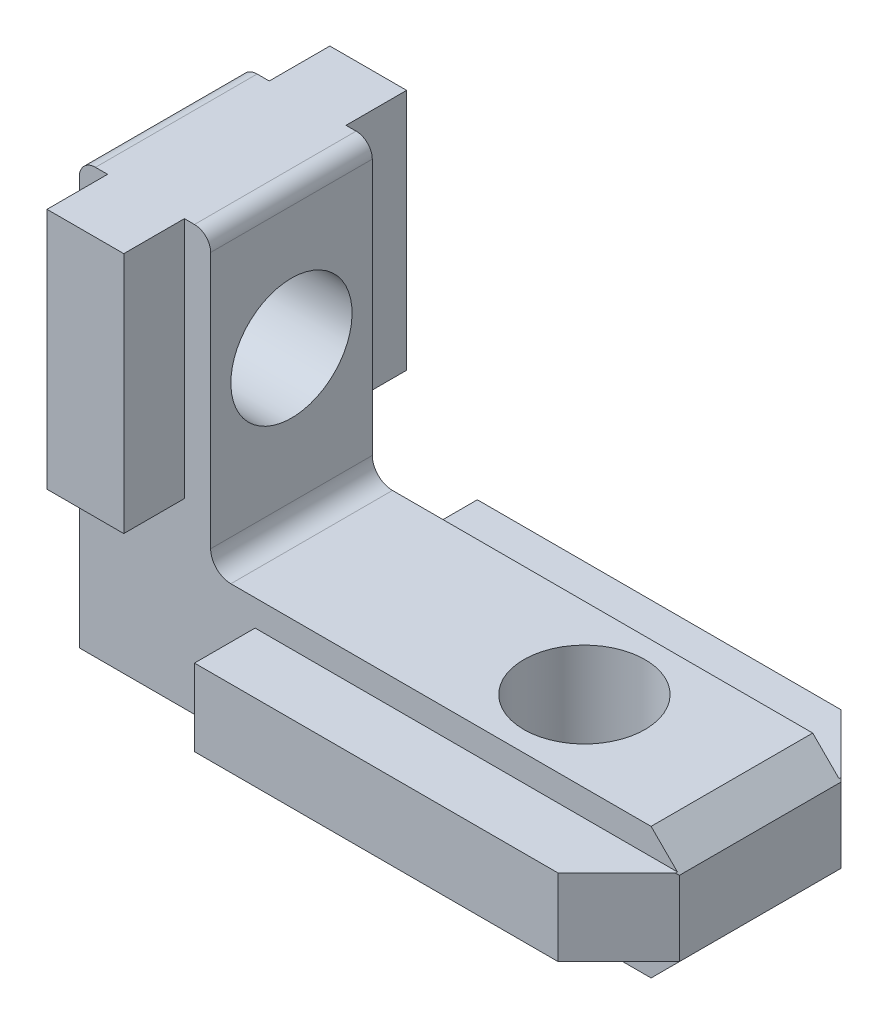
ISO-10303-21;
HEADER;
FILE_DESCRIPTION(('STEP AP214'),'2;1');
FILE_NAME('part.step','',(''),(''),'','','');
FILE_SCHEMA(('AUTOMOTIVE_DESIGN { 1 0 10303 214 1 1 1 1 }'));
ENDSEC;
DATA;
#1=APPLICATION_CONTEXT('core data for automotive mechanical design processes');
#2=APPLICATION_PROTOCOL_DEFINITION('international standard','automotive_design',2000,#1);
#3=PRODUCT_CONTEXT('',#1,'mechanical');
#4=PRODUCT('Part','Part','',(#3));
#5=PRODUCT_RELATED_PRODUCT_CATEGORY('part','',(#4));
#6=PRODUCT_DEFINITION_FORMATION('','',#4);
#7=PRODUCT_DEFINITION_CONTEXT('part definition',#1,'design');
#8=PRODUCT_DEFINITION('design','',#6,#7);
#9=PRODUCT_DEFINITION_SHAPE('','',#8);
#10=(LENGTH_UNIT() NAMED_UNIT(*) SI_UNIT(.MILLI.,.METRE.));
#11=(NAMED_UNIT(*) PLANE_ANGLE_UNIT() SI_UNIT($,.RADIAN.));
#12=(NAMED_UNIT(*) SI_UNIT($,.STERADIAN.) SOLID_ANGLE_UNIT());
#13=UNCERTAINTY_MEASURE_WITH_UNIT(LENGTH_MEASURE(1.E-05),#10,'distance_accuracy_value','');
#14=(GEOMETRIC_REPRESENTATION_CONTEXT(3) GLOBAL_UNCERTAINTY_ASSIGNED_CONTEXT((#13)) GLOBAL_UNIT_ASSIGNED_CONTEXT((#10,
#11,#12)) REPRESENTATION_CONTEXT('',''));
#15=CARTESIAN_POINT('',(0.,0.,0.));
#16=DIRECTION('',(0.,0.,1.));
#17=DIRECTION('',(1.,0.,0.));
#18=AXIS2_PLACEMENT_3D('',#15,#16,#17);
#19=CARTESIAN_POINT('',(0.,0.,-4.));
#20=DIRECTION('',(0.,0.,-1.));
#21=DIRECTION('',(-1.,0.,0.));
#22=AXIS2_PLACEMENT_3D('',#19,#20,#21);
#23=PLANE('',#22);
#24=DIRECTION('',(0.,-1.,0.));
#25=VECTOR('',#24,1.);
#26=CARTESIAN_POINT('',(-6.5,14.5,-4.));
#27=LINE('',#26,#25);
#28=CARTESIAN_POINT('',(-6.5,13.7,-4.));
#29=VERTEX_POINT('',#28);
#30=CARTESIAN_POINT('',(-6.5,-6.5,-4.));
#31=VERTEX_POINT('',#30);
#32=EDGE_CURVE('E418',#29,#31,#27,.T.);
#33=ORIENTED_EDGE('',*,*,#32,.F.);
#34=CARTESIAN_POINT('',(-5.7,13.7,-4.));
#35=DIRECTION('',(0.,0.,-1.));
#36=DIRECTION('',(-1.,0.,0.));
#37=AXIS2_PLACEMENT_3D('',#34,#35,#36);
#38=CIRCLE('',#37,0.8);
#39=CARTESIAN_POINT('',(-5.7,14.5,-4.));
#40=VERTEX_POINT('',#39);
#41=EDGE_CURVE('E396',#29,#40,#38,.T.);
#42=ORIENTED_EDGE('',*,*,#41,.T.);
#43=DIRECTION('',(-1.,0.,0.));
#44=VECTOR('',#43,1.);
#45=CARTESIAN_POINT('',(0.,14.5,-4.));
#46=LINE('',#45,#44);
#47=CARTESIAN_POINT('',(-5.1,14.5,-4.));
#48=VERTEX_POINT('',#47);
#49=EDGE_CURVE('E272',#48,#40,#46,.T.);
#50=ORIENTED_EDGE('',*,*,#49,.F.);
#51=DIRECTION('',(0.,-1.,0.));
#52=VECTOR('',#51,1.);
#53=CARTESIAN_POINT('',(-5.1,14.5,-4.));
#54=LINE('',#53,#52);
#55=CARTESIAN_POINT('',(-5.1,2.50000000000001,-4.));
#56=VERTEX_POINT('',#55);
#57=EDGE_CURVE('E224',#48,#56,#54,.T.);
#58=ORIENTED_EDGE('',*,*,#57,.T.);
#59=DIRECTION('',(1.,0.,0.));
#60=VECTOR('',#59,1.);
#61=CARTESIAN_POINT('',(-5.1,2.50000000000001,-4.));
#62=LINE('',#61,#60);
#63=CARTESIAN_POINT('',(-1.3,2.50000000000001,-4.));
#64=VERTEX_POINT('',#63);
#65=EDGE_CURVE('E254',#56,#64,#62,.T.);
#66=ORIENTED_EDGE('',*,*,#65,.T.);
#67=DIRECTION('',(0.,1.,0.));
#68=VECTOR('',#67,1.);
#69=CARTESIAN_POINT('',(-1.3,14.5,-4.));
#70=LINE('',#69,#68);
#71=CARTESIAN_POINT('',(-1.3,14.5,-4.));
#72=VERTEX_POINT('',#71);
#73=EDGE_CURVE('E268',#64,#72,#70,.T.);
#74=ORIENTED_EDGE('',*,*,#73,.T.);
#75=CARTESIAN_POINT('',(-0.799999999999999,14.5,-4.));
#76=VERTEX_POINT('',#75);
#77=EDGE_CURVE('E332',#76,#72,#46,.T.);
#78=ORIENTED_EDGE('',*,*,#77,.F.);
#79=CARTESIAN_POINT('',(-0.799999999999998,13.7,-4.));
#80=DIRECTION('',(0.,0.,-1.));
#81=DIRECTION('',(-1.,0.,0.));
#82=AXIS2_PLACEMENT_3D('',#79,#80,#81);
#83=CIRCLE('',#82,0.8);
#84=CARTESIAN_POINT('',(0.,13.7,-4.));
#85=VERTEX_POINT('',#84);
#86=EDGE_CURVE('E400',#76,#85,#83,.T.);
#87=ORIENTED_EDGE('',*,*,#86,.T.);
#88=DIRECTION('',(0.,1.,0.));
#89=VECTOR('',#88,1.);
#90=CARTESIAN_POINT('',(0.,0.,-4.));
#91=LINE('',#90,#89);
#92=CARTESIAN_POINT('',(0.,1.,-4.));
#93=VERTEX_POINT('',#92);
#94=EDGE_CURVE('E393',#93,#85,#91,.T.);
#95=ORIENTED_EDGE('',*,*,#94,.F.);
#96=CARTESIAN_POINT('',(1.,1.,-4.));
#97=DIRECTION('',(0.,0.,-1.));
#98=DIRECTION('',(-1.,0.,0.));
#99=AXIS2_PLACEMENT_3D('',#96,#97,#98);
#100=CIRCLE('',#99,1.);
#101=CARTESIAN_POINT('',(1.,0.,-4.));
#102=VERTEX_POINT('',#101);
#103=EDGE_CURVE('E11',#93,#102,#100,.F.);
#104=ORIENTED_EDGE('',*,*,#103,.T.);
#105=DIRECTION('',(-1.,0.,0.));
#106=VECTOR('',#105,1.);
#107=CARTESIAN_POINT('',(23.2,0.,-4.));
#108=LINE('',#107,#106);
#109=CARTESIAN_POINT('',(21.8,0.,-4.));
#110=VERTEX_POINT('',#109);
#111=EDGE_CURVE('E423',#110,#102,#108,.T.);
#112=ORIENTED_EDGE('',*,*,#111,.F.);
#113=DIRECTION('',(-0.707106781186548,0.707106781186547,0.));
#114=VECTOR('',#113,1.);
#115=CARTESIAN_POINT('',(10.9,10.9,-4.));
#116=LINE('',#115,#114);
#117=CARTESIAN_POINT('',(23.1,-1.3,-4.));
#118=VERTEX_POINT('',#117);
#119=EDGE_CURVE('E312',#110,#118,#116,.F.);
#120=ORIENTED_EDGE('',*,*,#119,.T.);
#121=DIRECTION('',(-1.,0.,0.));
#122=VECTOR('',#121,1.);
#123=CARTESIAN_POINT('',(23.2,-1.3,-4.));
#124=LINE('',#123,#122);
#125=CARTESIAN_POINT('',(2.2,-1.3,-4.));
#126=VERTEX_POINT('',#125);
#127=EDGE_CURVE('E234',#118,#126,#124,.T.);
#128=ORIENTED_EDGE('',*,*,#127,.T.);
#129=DIRECTION('',(0.,-1.,0.));
#130=VECTOR('',#129,1.);
#131=CARTESIAN_POINT('',(2.2,-5.1,-4.));
#132=LINE('',#131,#130);
#133=CARTESIAN_POINT('',(2.2,-5.1,-4.));
#134=VERTEX_POINT('',#133);
#135=EDGE_CURVE('E245',#126,#134,#132,.T.);
#136=ORIENTED_EDGE('',*,*,#135,.T.);
#137=DIRECTION('',(1.,0.,0.));
#138=VECTOR('',#137,1.);
#139=CARTESIAN_POINT('',(23.2,-5.1,-4.));
#140=LINE('',#139,#138);
#141=CARTESIAN_POINT('',(23.2,-5.1,-4.));
#142=VERTEX_POINT('',#141);
#143=EDGE_CURVE('E219',#134,#142,#140,.T.);
#144=ORIENTED_EDGE('',*,*,#143,.T.);
#145=DIRECTION('',(0.707106781186548,0.707106781186548,0.));
#146=VECTOR('',#145,1.);
#147=CARTESIAN_POINT('',(14.15,-14.15,-4.));
#148=LINE('',#147,#146);
#149=CARTESIAN_POINT('',(21.8,-6.5,-4.));
#150=VERTEX_POINT('',#149);
#151=EDGE_CURVE('E314',#142,#150,#148,.F.);
#152=ORIENTED_EDGE('',*,*,#151,.T.);
#153=DIRECTION('',(1.,0.,0.));
#154=VECTOR('',#153,1.);
#155=CARTESIAN_POINT('',(-6.5,-6.5,-4.));
#156=LINE('',#155,#154);
#157=EDGE_CURVE('E419',#31,#150,#156,.T.);
#158=ORIENTED_EDGE('',*,*,#157,.F.);
#159=EDGE_LOOP('',(#33,#42,#50,#58,#66,#74,#78,#87,#95,#104,#112,#120,#128,#136,#144,#152,#158));
#160=FACE_BOUND('',#159,.T.);
#161=ADVANCED_FACE('F35',(#160),#23,.T.);
#162=CARTESIAN_POINT('',(0.,0.,4.));
#163=DIRECTION('',(0.,0.,-1.));
#164=DIRECTION('',(-1.,0.,0.));
#165=AXIS2_PLACEMENT_3D('',#162,#163,#164);
#166=PLANE('',#165);
#167=DIRECTION('',(-1.,0.,0.));
#168=VECTOR('',#167,1.);
#169=CARTESIAN_POINT('',(0.,14.5,4.));
#170=LINE('',#169,#168);
#171=CARTESIAN_POINT('',(-5.09999999999999,14.5,4.));
#172=VERTEX_POINT('',#171);
#173=CARTESIAN_POINT('',(-5.7,14.5,4.));
#174=VERTEX_POINT('',#173);
#175=EDGE_CURVE('E331',#172,#174,#170,.T.);
#176=ORIENTED_EDGE('',*,*,#175,.T.);
#177=CARTESIAN_POINT('',(-5.7,13.7,4.));
#178=DIRECTION('',(0.,0.,-1.));
#179=DIRECTION('',(-1.,0.,0.));
#180=AXIS2_PLACEMENT_3D('',#177,#178,#179);
#181=CIRCLE('',#180,0.8);
#182=CARTESIAN_POINT('',(-6.5,13.7,4.));
#183=VERTEX_POINT('',#182);
#184=EDGE_CURVE('E389',#174,#183,#181,.F.);
#185=ORIENTED_EDGE('',*,*,#184,.T.);
#186=DIRECTION('',(0.,-1.,0.));
#187=VECTOR('',#186,1.);
#188=CARTESIAN_POINT('',(-6.5,14.5,4.));
#189=LINE('',#188,#187);
#190=CARTESIAN_POINT('',(-6.5,-6.5,4.));
#191=VERTEX_POINT('',#190);
#192=EDGE_CURVE('E330',#183,#191,#189,.T.);
#193=ORIENTED_EDGE('',*,*,#192,.T.);
#194=DIRECTION('',(1.,0.,0.));
#195=VECTOR('',#194,1.);
#196=CARTESIAN_POINT('',(-6.5,-6.5,4.));
#197=LINE('',#196,#195);
#198=CARTESIAN_POINT('',(21.8,-6.5,4.));
#199=VERTEX_POINT('',#198);
#200=EDGE_CURVE('E426',#191,#199,#197,.T.);
#201=ORIENTED_EDGE('',*,*,#200,.T.);
#202=DIRECTION('',(-0.707106781186548,-0.707106781186548,0.));
#203=VECTOR('',#202,1.);
#204=CARTESIAN_POINT('',(21.8,-6.5,4.));
#205=LINE('',#204,#203);
#206=CARTESIAN_POINT('',(23.2,-5.1,4.));
#207=VERTEX_POINT('',#206);
#208=EDGE_CURVE('E304',#199,#207,#205,.F.);
#209=ORIENTED_EDGE('',*,*,#208,.T.);
#210=DIRECTION('',(1.,0.,0.));
#211=VECTOR('',#210,1.);
#212=CARTESIAN_POINT('',(23.2,-5.1,4.));
#213=LINE('',#212,#211);
#214=CARTESIAN_POINT('',(2.2,-5.1,4.));
#215=VERTEX_POINT('',#214);
#216=EDGE_CURVE('E459',#215,#207,#213,.T.);
#217=ORIENTED_EDGE('',*,*,#216,.F.);
#218=DIRECTION('',(0.,-1.,0.));
#219=VECTOR('',#218,1.);
#220=CARTESIAN_POINT('',(2.2,-5.1,4.));
#221=LINE('',#220,#219);
#222=CARTESIAN_POINT('',(2.2,-1.3,4.));
#223=VERTEX_POINT('',#222);
#224=EDGE_CURVE('E821',#223,#215,#221,.T.);
#225=ORIENTED_EDGE('',*,*,#224,.F.);
#226=DIRECTION('',(-1.,0.,0.));
#227=VECTOR('',#226,1.);
#228=CARTESIAN_POINT('',(23.2,-1.3,4.));
#229=LINE('',#228,#227);
#230=CARTESIAN_POINT('',(23.1,-1.3,4.));
#231=VERTEX_POINT('',#230);
#232=EDGE_CURVE('E283',#231,#223,#229,.T.);
#233=ORIENTED_EDGE('',*,*,#232,.F.);
#234=DIRECTION('',(0.707106781186548,-0.707106781186547,0.));
#235=VECTOR('',#234,1.);
#236=CARTESIAN_POINT('',(23.2,-1.39999999999999,4.));
#237=LINE('',#236,#235);
#238=CARTESIAN_POINT('',(21.8,0.,4.));
#239=VERTEX_POINT('',#238);
#240=EDGE_CURVE('E302',#231,#239,#237,.F.);
#241=ORIENTED_EDGE('',*,*,#240,.T.);
#242=DIRECTION('',(-1.,0.,0.));
#243=VECTOR('',#242,1.);
#244=CARTESIAN_POINT('',(23.2,0.,4.));
#245=LINE('',#244,#243);
#246=CARTESIAN_POINT('',(1.,0.,4.));
#247=VERTEX_POINT('',#246);
#248=EDGE_CURVE('E376',#239,#247,#245,.T.);
#249=ORIENTED_EDGE('',*,*,#248,.T.);
#250=CARTESIAN_POINT('',(1.,1.,4.));
#251=DIRECTION('',(0.,0.,-1.));
#252=DIRECTION('',(-1.,0.,0.));
#253=AXIS2_PLACEMENT_3D('',#250,#251,#252);
#254=CIRCLE('',#253,1.);
#255=CARTESIAN_POINT('',(0.,1.,4.));
#256=VERTEX_POINT('',#255);
#257=EDGE_CURVE('E43',#247,#256,#254,.T.);
#258=ORIENTED_EDGE('',*,*,#257,.T.);
#259=DIRECTION('',(0.,1.,0.));
#260=VECTOR('',#259,1.);
#261=CARTESIAN_POINT('',(0.,0.,4.));
#262=LINE('',#261,#260);
#263=CARTESIAN_POINT('',(0.,13.7,4.));
#264=VERTEX_POINT('',#263);
#265=EDGE_CURVE('E337',#256,#264,#262,.T.);
#266=ORIENTED_EDGE('',*,*,#265,.T.);
#267=CARTESIAN_POINT('',(-0.799999999999998,13.7,4.));
#268=DIRECTION('',(0.,0.,-1.));
#269=DIRECTION('',(-1.,0.,0.));
#270=AXIS2_PLACEMENT_3D('',#267,#268,#269);
#271=CIRCLE('',#270,0.8);
#272=CARTESIAN_POINT('',(-0.799999999999999,14.5,4.));
#273=VERTEX_POINT('',#272);
#274=EDGE_CURVE('E380',#264,#273,#271,.F.);
#275=ORIENTED_EDGE('',*,*,#274,.T.);
#276=CARTESIAN_POINT('',(-1.3,14.5,4.));
#277=VERTEX_POINT('',#276);
#278=EDGE_CURVE('E327',#273,#277,#170,.T.);
#279=ORIENTED_EDGE('',*,*,#278,.T.);
#280=DIRECTION('',(0.,1.,0.));
#281=VECTOR('',#280,1.);
#282=CARTESIAN_POINT('',(-1.3,14.5,4.));
#283=LINE('',#282,#281);
#284=CARTESIAN_POINT('',(-1.3,2.50000000000001,4.));
#285=VERTEX_POINT('',#284);
#286=EDGE_CURVE('E361',#285,#277,#283,.T.);
#287=ORIENTED_EDGE('',*,*,#286,.F.);
#288=DIRECTION('',(1.,0.,0.));
#289=VECTOR('',#288,1.);
#290=CARTESIAN_POINT('',(-5.1,2.50000000000001,4.));
#291=LINE('',#290,#289);
#292=CARTESIAN_POINT('',(-5.1,2.50000000000001,4.));
#293=VERTEX_POINT('',#292);
#294=EDGE_CURVE('E350',#293,#285,#291,.T.);
#295=ORIENTED_EDGE('',*,*,#294,.F.);
#296=DIRECTION('',(0.,-1.,0.));
#297=VECTOR('',#296,1.);
#298=CARTESIAN_POINT('',(-5.1,14.5,4.));
#299=LINE('',#298,#297);
#300=EDGE_CURVE('E347',#172,#293,#299,.T.);
#301=ORIENTED_EDGE('',*,*,#300,.F.);
#302=EDGE_LOOP('',(#176,#185,#193,#201,#209,#217,#225,#233,#241,#249,#258,#266,#275,#279,#287,
#295,#301));
#303=FACE_BOUND('',#302,.T.);
#304=ADVANCED_FACE('F379',(#303),#166,.F.);
#305=CARTESIAN_POINT('',(23.2,0.,-4.));
#306=DIRECTION('',(0.,1.,0.));
#307=DIRECTION('',(-1.,0.,0.));
#308=AXIS2_PLACEMENT_3D('',#305,#306,#307);
#309=PLANE('',#308);
#310=CARTESIAN_POINT('',(14.5,0.,0.));
#311=DIRECTION('',(0.,1.,0.));
#312=DIRECTION('',(0.,0.,1.));
#313=AXIS2_PLACEMENT_3D('',#310,#311,#312);
#314=CIRCLE('',#313,3.);
#315=CARTESIAN_POINT('',(14.5,0.,3.));
#316=VERTEX_POINT('',#315);
#317=EDGE_CURVE('E246',#316,#316,#314,.T.);
#318=ORIENTED_EDGE('',*,*,#317,.F.);
#319=EDGE_LOOP('',(#318));
#320=FACE_BOUND('',#319,.T.);
#321=ORIENTED_EDGE('',*,*,#111,.T.);
#322=DIRECTION('',(0.,0.,1.));
#323=VECTOR('',#322,1.);
#324=CARTESIAN_POINT('',(1.,0.,4.));
#325=LINE('',#324,#323);
#326=EDGE_CURVE('E395',#102,#247,#325,.T.);
#327=ORIENTED_EDGE('',*,*,#326,.T.);
#328=ORIENTED_EDGE('',*,*,#248,.F.);
#329=DIRECTION('',(0.,0.,-1.));
#330=VECTOR('',#329,1.);
#331=CARTESIAN_POINT('',(21.8,0.,-4.));
#332=LINE('',#331,#330);
#333=EDGE_CURVE('E320',#239,#110,#332,.T.);
#334=ORIENTED_EDGE('',*,*,#333,.T.);
#335=EDGE_LOOP('',(#321,#327,#328,#334));
#336=FACE_BOUND('',#335,.T.);
#337=ADVANCED_FACE('F484',(#320,#336),#309,.T.);
#338=CARTESIAN_POINT('',(23.2,-6.5,-4.));
#339=DIRECTION('',(1.,0.,0.));
#340=DIRECTION('',(0.,0.,-1.));
#341=AXIS2_PLACEMENT_3D('',#338,#339,#340);
#342=PLANE('',#341);
#343=DIRECTION('',(0.,-1.,0.));
#344=VECTOR('',#343,1.);
#345=CARTESIAN_POINT('',(23.2,-6.5,4.));
#346=LINE('',#345,#344);
#347=CARTESIAN_POINT('',(23.2,-1.39999999999999,4.));
#348=VERTEX_POINT('',#347);
#349=EDGE_CURVE('E448',#348,#207,#346,.T.);
#350=ORIENTED_EDGE('',*,*,#349,.T.);
#351=DIRECTION('',(0.,0.,-1.));
#352=VECTOR('',#351,1.);
#353=CARTESIAN_POINT('',(23.2,-5.09999999999999,-4.));
#354=LINE('',#353,#352);
#355=EDGE_CURVE('E310',#207,#142,#354,.T.);
#356=ORIENTED_EDGE('',*,*,#355,.T.);
#357=DIRECTION('',(0.,1.,0.));
#358=VECTOR('',#357,1.);
#359=CARTESIAN_POINT('',(23.2,-6.5,-4.));
#360=LINE('',#359,#358);
#361=CARTESIAN_POINT('',(23.2,-1.39999999999999,-4.00000000000001));
#362=VERTEX_POINT('',#361);
#363=EDGE_CURVE('E290',#142,#362,#360,.T.);
#364=ORIENTED_EDGE('',*,*,#363,.T.);
#365=DIRECTION('',(0.,0.,1.));
#366=VECTOR('',#365,1.);
#367=CARTESIAN_POINT('',(23.2,-1.39999999999999,-4.));
#368=LINE('',#367,#366);
#369=EDGE_CURVE('E307',#362,#348,#368,.T.);
#370=ORIENTED_EDGE('',*,*,#369,.T.);
#371=EDGE_LOOP('',(#350,#356,#364,#370));
#372=FACE_BOUND('',#371,.T.);
#373=ADVANCED_FACE('F539',(#372),#342,.T.);
#374=CARTESIAN_POINT('',(-6.5,-6.5,-4.));
#375=DIRECTION('',(0.,-1.,0.));
#376=DIRECTION('',(1.,0.,0.));
#377=AXIS2_PLACEMENT_3D('',#374,#375,#376);
#378=PLANE('',#377);
#379=CARTESIAN_POINT('',(14.5,-6.5,0.));
#380=DIRECTION('',(0.,-1.,0.));
#381=DIRECTION('',(1.,0.,0.));
#382=AXIS2_PLACEMENT_3D('',#379,#380,#381);
#383=CIRCLE('',#382,3.);
#384=CARTESIAN_POINT('',(17.5,-6.5,0.));
#385=VERTEX_POINT('',#384);
#386=EDGE_CURVE('E847',#385,#385,#383,.F.);
#387=ORIENTED_EDGE('',*,*,#386,.T.);
#388=EDGE_LOOP('',(#387));
#389=FACE_BOUND('',#388,.T.);
#390=ORIENTED_EDGE('',*,*,#157,.T.);
#391=DIRECTION('',(0.,0.,1.));
#392=VECTOR('',#391,1.);
#393=CARTESIAN_POINT('',(21.8,-6.5,-4.));
#394=LINE('',#393,#392);
#395=EDGE_CURVE('E299',#150,#199,#394,.T.);
#396=ORIENTED_EDGE('',*,*,#395,.T.);
#397=ORIENTED_EDGE('',*,*,#200,.F.);
#398=DIRECTION('',(0.,0.,1.));
#399=VECTOR('',#398,1.);
#400=CARTESIAN_POINT('',(-6.5,-6.5,-4.));
#401=LINE('',#400,#399);
#402=EDGE_CURVE('E345',#31,#191,#401,.T.);
#403=ORIENTED_EDGE('',*,*,#402,.F.);
#404=EDGE_LOOP('',(#390,#396,#397,#403));
#405=FACE_BOUND('',#404,.T.);
#406=ADVANCED_FACE('F502',(#389,#405),#378,.T.);
#407=CARTESIAN_POINT('',(-6.5,14.5,-4.));
#408=DIRECTION('',(-1.,0.,0.));
#409=DIRECTION('',(0.,-1.,0.));
#410=AXIS2_PLACEMENT_3D('',#407,#408,#409);
#411=PLANE('',#410);
#412=CARTESIAN_POINT('',(-6.5,7.6,0.));
#413=DIRECTION('',(-1.,0.,0.));
#414=DIRECTION('',(0.,-1.,0.));
#415=AXIS2_PLACEMENT_3D('',#412,#413,#414);
#416=CIRCLE('',#415,3.);
#417=CARTESIAN_POINT('',(-6.5,10.6,0.));
#418=VERTEX_POINT('',#417);
#419=EDGE_CURVE('E853',#418,#418,#416,.F.);
#420=ORIENTED_EDGE('',*,*,#419,.T.);
#421=EDGE_LOOP('',(#420));
#422=FACE_BOUND('',#421,.T.);
#423=ORIENTED_EDGE('',*,*,#192,.F.);
#424=DIRECTION('',(0.,0.,1.));
#425=VECTOR('',#424,1.);
#426=CARTESIAN_POINT('',(-6.5,13.7,-4.));
#427=LINE('',#426,#425);
#428=EDGE_CURVE('E405',#183,#29,#427,.F.);
#429=ORIENTED_EDGE('',*,*,#428,.T.);
#430=ORIENTED_EDGE('',*,*,#32,.T.);
#431=ORIENTED_EDGE('',*,*,#402,.T.);
#432=EDGE_LOOP('',(#423,#429,#430,#431));
#433=FACE_BOUND('',#432,.T.);
#434=ADVANCED_FACE('F504',(#422,#433),#411,.T.);
#435=CARTESIAN_POINT('',(0.,14.5,-4.));
#436=DIRECTION('',(0.,1.,0.));
#437=DIRECTION('',(-1.,0.,0.));
#438=AXIS2_PLACEMENT_3D('',#435,#436,#437);
#439=PLANE('',#438);
#440=ORIENTED_EDGE('',*,*,#49,.T.);
#441=DIRECTION('',(0.,0.,1.));
#442=VECTOR('',#441,1.);
#443=CARTESIAN_POINT('',(-5.7,14.5,-4.));
#444=LINE('',#443,#442);
#445=EDGE_CURVE('E390',#40,#174,#444,.T.);
#446=ORIENTED_EDGE('',*,*,#445,.T.);
#447=ORIENTED_EDGE('',*,*,#175,.F.);
#448=DIRECTION('',(0.,0.,-1.));
#449=VECTOR('',#448,1.);
#450=CARTESIAN_POINT('',(-5.1,14.5,7.));
#451=LINE('',#450,#449);
#452=CARTESIAN_POINT('',(-5.1,14.5,7.));
#453=VERTEX_POINT('',#452);
#454=EDGE_CURVE('E354',#453,#172,#451,.T.);
#455=ORIENTED_EDGE('',*,*,#454,.F.);
#456=DIRECTION('',(-1.,0.,0.));
#457=VECTOR('',#456,1.);
#458=CARTESIAN_POINT('',(-5.1,14.5,7.));
#459=LINE('',#458,#457);
#460=CARTESIAN_POINT('',(-1.3,14.5,7.));
#461=VERTEX_POINT('',#460);
#462=EDGE_CURVE('E358',#461,#453,#459,.T.);
#463=ORIENTED_EDGE('',*,*,#462,.F.);
#464=DIRECTION('',(0.,0.,-1.));
#465=VECTOR('',#464,1.);
#466=CARTESIAN_POINT('',(-1.3,14.5,7.));
#467=LINE('',#466,#465);
#468=EDGE_CURVE('E357',#461,#277,#467,.T.);
#469=ORIENTED_EDGE('',*,*,#468,.T.);
#470=ORIENTED_EDGE('',*,*,#278,.F.);
#471=DIRECTION('',(0.,0.,1.));
#472=VECTOR('',#471,1.);
#473=CARTESIAN_POINT('',(-0.799999999999999,14.5,-4.));
#474=LINE('',#473,#472);
#475=EDGE_CURVE('E326',#273,#76,#474,.F.);
#476=ORIENTED_EDGE('',*,*,#475,.T.);
#477=ORIENTED_EDGE('',*,*,#77,.T.);
#478=DIRECTION('',(0.,0.,1.));
#479=VECTOR('',#478,1.);
#480=CARTESIAN_POINT('',(-1.3,14.5,-7.));
#481=LINE('',#480,#479);
#482=CARTESIAN_POINT('',(-1.3,14.5,-7.));
#483=VERTEX_POINT('',#482);
#484=EDGE_CURVE('E275',#483,#72,#481,.T.);
#485=ORIENTED_EDGE('',*,*,#484,.F.);
#486=DIRECTION('',(-1.,0.,0.));
#487=VECTOR('',#486,1.);
#488=CARTESIAN_POINT('',(-5.1,14.5,-7.));
#489=LINE('',#488,#487);
#490=CARTESIAN_POINT('',(-5.1,14.5,-7.));
#491=VERTEX_POINT('',#490);
#492=EDGE_CURVE('E253',#483,#491,#489,.T.);
#493=ORIENTED_EDGE('',*,*,#492,.T.);
#494=DIRECTION('',(0.,0.,1.));
#495=VECTOR('',#494,1.);
#496=CARTESIAN_POINT('',(-5.1,14.5,-7.));
#497=LINE('',#496,#495);
#498=EDGE_CURVE('E278',#491,#48,#497,.T.);
#499=ORIENTED_EDGE('',*,*,#498,.T.);
#500=EDGE_LOOP('',(#440,#446,#447,#455,#463,#469,#470,#476,#477,#485,#493,#499));
#501=FACE_BOUND('',#500,.T.);
#502=ADVANCED_FACE('F412',(#501),#439,.T.);
#503=CARTESIAN_POINT('',(0.,0.,-4.));
#504=DIRECTION('',(1.,0.,0.));
#505=DIRECTION('',(0.,1.,0.));
#506=AXIS2_PLACEMENT_3D('',#503,#504,#505);
#507=PLANE('',#506);
#508=CARTESIAN_POINT('',(0.,7.60000000000001,0.));
#509=DIRECTION('',(1.,0.,0.));
#510=DIRECTION('',(0.,1.,0.));
#511=AXIS2_PLACEMENT_3D('',#508,#509,#510);
#512=CIRCLE('',#511,3.);
#513=CARTESIAN_POINT('',(0.,10.6,0.));
#514=VERTEX_POINT('',#513);
#515=EDGE_CURVE('E851',#514,#514,#512,.T.);
#516=ORIENTED_EDGE('',*,*,#515,.F.);
#517=EDGE_LOOP('',(#516));
#518=FACE_BOUND('',#517,.T.);
#519=ORIENTED_EDGE('',*,*,#265,.F.);
#520=DIRECTION('',(0.,0.,1.));
#521=VECTOR('',#520,1.);
#522=CARTESIAN_POINT('',(0.,1.,-4.));
#523=LINE('',#522,#521);
#524=EDGE_CURVE('E56',#256,#93,#523,.F.);
#525=ORIENTED_EDGE('',*,*,#524,.T.);
#526=ORIENTED_EDGE('',*,*,#94,.T.);
#527=DIRECTION('',(0.,0.,1.));
#528=VECTOR('',#527,1.);
#529=CARTESIAN_POINT('',(0.,13.7,-4.));
#530=LINE('',#529,#528);
#531=EDGE_CURVE('E388',#85,#264,#530,.T.);
#532=ORIENTED_EDGE('',*,*,#531,.T.);
#533=EDGE_LOOP('',(#519,#525,#526,#532));
#534=FACE_BOUND('',#533,.T.);
#535=ADVANCED_FACE('F392',(#518,#534),#507,.T.);
#536=CARTESIAN_POINT('',(-5.1,14.5,7.));
#537=DIRECTION('',(1.,0.,0.));
#538=DIRECTION('',(0.,1.,0.));
#539=AXIS2_PLACEMENT_3D('',#536,#537,#538);
#540=PLANE('',#539);
#541=ORIENTED_EDGE('',*,*,#300,.T.);
#542=DIRECTION('',(0.,0.,-1.));
#543=VECTOR('',#542,1.);
#544=CARTESIAN_POINT('',(-5.1,2.50000000000001,7.));
#545=LINE('',#544,#543);
#546=CARTESIAN_POINT('',(-5.1,2.50000000000001,7.));
#547=VERTEX_POINT('',#546);
#548=EDGE_CURVE('E374',#547,#293,#545,.T.);
#549=ORIENTED_EDGE('',*,*,#548,.F.);
#550=DIRECTION('',(0.,-1.,0.));
#551=VECTOR('',#550,1.);
#552=CARTESIAN_POINT('',(-5.1,14.5,7.));
#553=LINE('',#552,#551);
#554=EDGE_CURVE('E365',#453,#547,#553,.T.);
#555=ORIENTED_EDGE('',*,*,#554,.F.);
#556=ORIENTED_EDGE('',*,*,#454,.T.);
#557=EDGE_LOOP('',(#541,#549,#555,#556));
#558=FACE_BOUND('',#557,.T.);
#559=ADVANCED_FACE('F553',(#558),#540,.F.);
#560=CARTESIAN_POINT('',(-5.1,2.50000000000001,7.));
#561=DIRECTION('',(0.,1.,0.));
#562=DIRECTION('',(0.,0.,1.));
#563=AXIS2_PLACEMENT_3D('',#560,#561,#562);
#564=PLANE('',#563);
#565=ORIENTED_EDGE('',*,*,#294,.T.);
#566=DIRECTION('',(0.,0.,-1.));
#567=VECTOR('',#566,1.);
#568=CARTESIAN_POINT('',(-1.3,2.50000000000001,7.));
#569=LINE('',#568,#567);
#570=CARTESIAN_POINT('',(-1.3,2.50000000000001,7.));
#571=VERTEX_POINT('',#570);
#572=EDGE_CURVE('E371',#571,#285,#569,.T.);
#573=ORIENTED_EDGE('',*,*,#572,.F.);
#574=DIRECTION('',(1.,0.,0.));
#575=VECTOR('',#574,1.);
#576=CARTESIAN_POINT('',(-5.1,2.50000000000001,7.));
#577=LINE('',#576,#575);
#578=EDGE_CURVE('E829',#547,#571,#577,.T.);
#579=ORIENTED_EDGE('',*,*,#578,.F.);
#580=ORIENTED_EDGE('',*,*,#548,.T.);
#581=EDGE_LOOP('',(#565,#573,#579,#580));
#582=FACE_BOUND('',#581,.T.);
#583=ADVANCED_FACE('F683',(#582),#564,.F.);
#584=CARTESIAN_POINT('',(-1.3,14.5,7.));
#585=DIRECTION('',(-1.,0.,0.));
#586=DIRECTION('',(0.,-1.,0.));
#587=AXIS2_PLACEMENT_3D('',#584,#585,#586);
#588=PLANE('',#587);
#589=ORIENTED_EDGE('',*,*,#286,.T.);
#590=ORIENTED_EDGE('',*,*,#468,.F.);
#591=DIRECTION('',(0.,1.,0.));
#592=VECTOR('',#591,1.);
#593=CARTESIAN_POINT('',(-1.3,14.5,7.));
#594=LINE('',#593,#592);
#595=EDGE_CURVE('E831',#571,#461,#594,.T.);
#596=ORIENTED_EDGE('',*,*,#595,.F.);
#597=ORIENTED_EDGE('',*,*,#572,.T.);
#598=EDGE_LOOP('',(#589,#590,#596,#597));
#599=FACE_BOUND('',#598,.T.);
#600=ADVANCED_FACE('F690',(#599),#588,.F.);
#601=CARTESIAN_POINT('',(0.,0.,7.));
#602=DIRECTION('',(0.,0.,1.));
#603=DIRECTION('',(1.,0.,0.));
#604=AXIS2_PLACEMENT_3D('',#601,#602,#603);
#605=PLANE('',#604);
#606=ORIENTED_EDGE('',*,*,#554,.T.);
#607=ORIENTED_EDGE('',*,*,#578,.T.);
#608=ORIENTED_EDGE('',*,*,#595,.T.);
#609=ORIENTED_EDGE('',*,*,#462,.T.);
#610=EDGE_LOOP('',(#606,#607,#608,#609));
#611=FACE_BOUND('',#610,.T.);
#612=ADVANCED_FACE('F698',(#611),#605,.T.);
#613=CARTESIAN_POINT('',(23.2,-1.3,7.));
#614=DIRECTION('',(0.,-1.,0.));
#615=DIRECTION('',(1.,0.,0.));
#616=AXIS2_PLACEMENT_3D('',#613,#614,#615);
#617=PLANE('',#616);
#618=DIRECTION('',(-0.707106781186549,0.,0.707106781186546));
#619=VECTOR('',#618,1.);
#620=CARTESIAN_POINT('',(20.2,-1.3,7.));
#621=LINE('',#620,#619);
#622=CARTESIAN_POINT('',(20.2,-1.3,7.));
#623=VERTEX_POINT('',#622);
#624=CARTESIAN_POINT('',(23.1,-1.3,4.1));
#625=VERTEX_POINT('',#624);
#626=EDGE_CURVE('E441',#623,#625,#621,.F.);
#627=ORIENTED_EDGE('',*,*,#626,.T.);
#628=DIRECTION('',(0.,0.,1.));
#629=VECTOR('',#628,1.);
#630=CARTESIAN_POINT('',(23.1,-1.3,-4.));
#631=LINE('',#630,#629);
#632=EDGE_CURVE('E318',#625,#231,#631,.F.);
#633=ORIENTED_EDGE('',*,*,#632,.T.);
#634=ORIENTED_EDGE('',*,*,#232,.T.);
#635=DIRECTION('',(0.,0.,-1.));
#636=VECTOR('',#635,1.);
#637=CARTESIAN_POINT('',(2.2,-1.3,7.));
#638=LINE('',#637,#636);
#639=CARTESIAN_POINT('',(2.2,-1.3,7.));
#640=VERTEX_POINT('',#639);
#641=EDGE_CURVE('E351',#640,#223,#638,.T.);
#642=ORIENTED_EDGE('',*,*,#641,.F.);
#643=DIRECTION('',(-1.,0.,0.));
#644=VECTOR('',#643,1.);
#645=CARTESIAN_POINT('',(23.2,-1.3,7.));
#646=LINE('',#645,#644);
#647=EDGE_CURVE('E475',#623,#640,#646,.T.);
#648=ORIENTED_EDGE('',*,*,#647,.F.);
#649=EDGE_LOOP('',(#627,#633,#634,#642,#648));
#650=FACE_BOUND('',#649,.T.);
#651=ADVANCED_FACE('F472',(#650),#617,.F.);
#652=CARTESIAN_POINT('',(2.2,-5.1,7.));
#653=DIRECTION('',(1.,0.,0.));
#654=DIRECTION('',(0.,0.,-1.));
#655=AXIS2_PLACEMENT_3D('',#652,#653,#654);
#656=PLANE('',#655);
#657=ORIENTED_EDGE('',*,*,#224,.T.);
#658=DIRECTION('',(0.,0.,-1.));
#659=VECTOR('',#658,1.);
#660=CARTESIAN_POINT('',(2.2,-5.1,7.));
#661=LINE('',#660,#659);
#662=CARTESIAN_POINT('',(2.2,-5.1,7.));
#663=VERTEX_POINT('',#662);
#664=EDGE_CURVE('E467',#663,#215,#661,.T.);
#665=ORIENTED_EDGE('',*,*,#664,.F.);
#666=DIRECTION('',(0.,-1.,0.));
#667=VECTOR('',#666,1.);
#668=CARTESIAN_POINT('',(2.2,-5.1,7.));
#669=LINE('',#668,#667);
#670=EDGE_CURVE('E465',#640,#663,#669,.T.);
#671=ORIENTED_EDGE('',*,*,#670,.F.);
#672=ORIENTED_EDGE('',*,*,#641,.T.);
#673=EDGE_LOOP('',(#657,#665,#671,#672));
#674=FACE_BOUND('',#673,.T.);
#675=ADVANCED_FACE('F714',(#674),#656,.F.);
#676=CARTESIAN_POINT('',(23.2,-5.1,7.));
#677=DIRECTION('',(0.,1.,0.));
#678=DIRECTION('',(-1.,0.,0.));
#679=AXIS2_PLACEMENT_3D('',#676,#677,#678);
#680=PLANE('',#679);
#681=ORIENTED_EDGE('',*,*,#216,.T.);
#682=DIRECTION('',(0.707106781186549,0.,-0.707106781186546));
#683=VECTOR('',#682,1.);
#684=CARTESIAN_POINT('',(20.2,-5.1,7.));
#685=LINE('',#684,#683);
#686=CARTESIAN_POINT('',(20.2,-5.1,7.));
#687=VERTEX_POINT('',#686);
#688=EDGE_CURVE('E294',#207,#687,#685,.F.);
#689=ORIENTED_EDGE('',*,*,#688,.T.);
#690=DIRECTION('',(1.,0.,0.));
#691=VECTOR('',#690,1.);
#692=CARTESIAN_POINT('',(23.2,-5.1,7.));
#693=LINE('',#692,#691);
#694=EDGE_CURVE('E458',#663,#687,#693,.T.);
#695=ORIENTED_EDGE('',*,*,#694,.F.);
#696=ORIENTED_EDGE('',*,*,#664,.T.);
#697=EDGE_LOOP('',(#681,#689,#695,#696));
#698=FACE_BOUND('',#697,.T.);
#699=ADVANCED_FACE('F456',(#698),#680,.F.);
#700=CARTESIAN_POINT('',(0.,0.,7.));
#701=DIRECTION('',(0.,0.,1.));
#702=DIRECTION('',(1.,0.,0.));
#703=AXIS2_PLACEMENT_3D('',#700,#701,#702);
#704=PLANE('',#703);
#705=ORIENTED_EDGE('',*,*,#694,.T.);
#706=DIRECTION('',(0.,1.,0.));
#707=VECTOR('',#706,1.);
#708=CARTESIAN_POINT('',(20.2,0.,7.));
#709=LINE('',#708,#707);
#710=EDGE_CURVE('E436',#687,#623,#709,.T.);
#711=ORIENTED_EDGE('',*,*,#710,.T.);
#712=ORIENTED_EDGE('',*,*,#647,.T.);
#713=ORIENTED_EDGE('',*,*,#670,.T.);
#714=EDGE_LOOP('',(#705,#711,#712,#713));
#715=FACE_BOUND('',#714,.T.);
#716=ADVANCED_FACE('F463',(#715),#704,.T.);
#717=CARTESIAN_POINT('',(20.2,0.,7.));
#718=DIRECTION('',(-0.707106781186546,0.,-0.707106781186549));
#719=DIRECTION('',(0.,1.,0.));
#720=AXIS2_PLACEMENT_3D('',#717,#718,#719);
#721=PLANE('',#720);
#722=ORIENTED_EDGE('',*,*,#349,.F.);
#723=DIRECTION('',(-0.577350269189627,0.577350269189625,0.577350269189625));
#724=VECTOR('',#723,1.);
#725=CARTESIAN_POINT('',(20.7333333333333,1.06666666666667,6.46666666666667));
#726=LINE('',#725,#724);
#727=EDGE_CURVE('E316',#348,#625,#726,.T.);
#728=ORIENTED_EDGE('',*,*,#727,.T.);
#729=ORIENTED_EDGE('',*,*,#626,.F.);
#730=ORIENTED_EDGE('',*,*,#710,.F.);
#731=ORIENTED_EDGE('',*,*,#688,.F.);
#732=EDGE_LOOP('',(#722,#728,#729,#730,#731));
#733=FACE_BOUND('',#732,.T.);
#734=ADVANCED_FACE('F469',(#733),#721,.F.);
#735=CARTESIAN_POINT('',(-5.1,14.5,-7.));
#736=DIRECTION('',(-1.,0.,0.));
#737=DIRECTION('',(0.,-1.,0.));
#738=AXIS2_PLACEMENT_3D('',#735,#736,#737);
#739=PLANE('',#738);
#740=ORIENTED_EDGE('',*,*,#57,.F.);
#741=ORIENTED_EDGE('',*,*,#498,.F.);
#742=DIRECTION('',(0.,-1.,0.));
#743=VECTOR('',#742,1.);
#744=CARTESIAN_POINT('',(-5.1,14.5,-7.));
#745=LINE('',#744,#743);
#746=CARTESIAN_POINT('',(-5.1,2.50000000000001,-7.));
#747=VERTEX_POINT('',#746);
#748=EDGE_CURVE('E250',#491,#747,#745,.T.);
#749=ORIENTED_EDGE('',*,*,#748,.T.);
#750=DIRECTION('',(0.,0.,1.));
#751=VECTOR('',#750,1.);
#752=CARTESIAN_POINT('',(-5.1,2.50000000000001,-7.));
#753=LINE('',#752,#751);
#754=EDGE_CURVE('E263',#747,#56,#753,.T.);
#755=ORIENTED_EDGE('',*,*,#754,.T.);
#756=EDGE_LOOP('',(#740,#741,#749,#755));
#757=FACE_BOUND('',#756,.T.);
#758=ADVANCED_FACE('F511',(#757),#739,.T.);
#759=CARTESIAN_POINT('',(-1.3,14.5,-7.));
#760=DIRECTION('',(1.,0.,0.));
#761=DIRECTION('',(0.,1.,0.));
#762=AXIS2_PLACEMENT_3D('',#759,#760,#761);
#763=PLANE('',#762);
#764=ORIENTED_EDGE('',*,*,#73,.F.);
#765=DIRECTION('',(0.,0.,1.));
#766=VECTOR('',#765,1.);
#767=CARTESIAN_POINT('',(-1.3,2.50000000000001,-7.));
#768=LINE('',#767,#766);
#769=CARTESIAN_POINT('',(-1.3,2.50000000000001,-7.));
#770=VERTEX_POINT('',#769);
#771=EDGE_CURVE('E279',#770,#64,#768,.T.);
#772=ORIENTED_EDGE('',*,*,#771,.F.);
#773=DIRECTION('',(0.,1.,0.));
#774=VECTOR('',#773,1.);
#775=CARTESIAN_POINT('',(-1.3,14.5,-7.));
#776=LINE('',#775,#774);
#777=EDGE_CURVE('E257',#770,#483,#776,.T.);
#778=ORIENTED_EDGE('',*,*,#777,.T.);
#779=ORIENTED_EDGE('',*,*,#484,.T.);
#780=EDGE_LOOP('',(#764,#772,#778,#779));
#781=FACE_BOUND('',#780,.T.);
#782=ADVANCED_FACE('F519',(#781),#763,.T.);
#783=CARTESIAN_POINT('',(-5.1,2.50000000000001,-7.));
#784=DIRECTION('',(0.,-1.,0.));
#785=DIRECTION('',(0.,0.,-1.));
#786=AXIS2_PLACEMENT_3D('',#783,#784,#785);
#787=PLANE('',#786);
#788=ORIENTED_EDGE('',*,*,#65,.F.);
#789=ORIENTED_EDGE('',*,*,#754,.F.);
#790=DIRECTION('',(1.,0.,0.));
#791=VECTOR('',#790,1.);
#792=CARTESIAN_POINT('',(-5.1,2.50000000000001,-7.));
#793=LINE('',#792,#791);
#794=EDGE_CURVE('E260',#747,#770,#793,.T.);
#795=ORIENTED_EDGE('',*,*,#794,.T.);
#796=ORIENTED_EDGE('',*,*,#771,.T.);
#797=EDGE_LOOP('',(#788,#789,#795,#796));
#798=FACE_BOUND('',#797,.T.);
#799=ADVANCED_FACE('F515',(#798),#787,.T.);
#800=CARTESIAN_POINT('',(0.,0.,-7.));
#801=DIRECTION('',(0.,0.,-1.));
#802=DIRECTION('',(1.,0.,0.));
#803=AXIS2_PLACEMENT_3D('',#800,#801,#802);
#804=PLANE('',#803);
#805=ORIENTED_EDGE('',*,*,#748,.F.);
#806=ORIENTED_EDGE('',*,*,#492,.F.);
#807=ORIENTED_EDGE('',*,*,#777,.F.);
#808=ORIENTED_EDGE('',*,*,#794,.F.);
#809=EDGE_LOOP('',(#805,#806,#807,#808));
#810=FACE_BOUND('',#809,.T.);
#811=ADVANCED_FACE('F522',(#810),#804,.T.);
#812=CARTESIAN_POINT('',(23.2,-5.1,-7.));
#813=DIRECTION('',(0.,-1.,0.));
#814=DIRECTION('',(1.,0.,0.));
#815=AXIS2_PLACEMENT_3D('',#812,#813,#814);
#816=PLANE('',#815);
#817=DIRECTION('',(1.,0.,0.));
#818=VECTOR('',#817,1.);
#819=CARTESIAN_POINT('',(23.2,-5.1,-7.));
#820=LINE('',#819,#818);
#821=CARTESIAN_POINT('',(2.2,-5.1,-7.));
#822=VERTEX_POINT('',#821);
#823=CARTESIAN_POINT('',(20.2,-5.1,-7.));
#824=VERTEX_POINT('',#823);
#825=EDGE_CURVE('E216',#822,#824,#820,.T.);
#826=ORIENTED_EDGE('',*,*,#825,.T.);
#827=DIRECTION('',(-0.707106781186548,0.,-0.707106781186547));
#828=VECTOR('',#827,1.);
#829=CARTESIAN_POINT('',(21.7,-5.1,-5.5));
#830=LINE('',#829,#828);
#831=EDGE_CURVE('E297',#824,#142,#830,.F.);
#832=ORIENTED_EDGE('',*,*,#831,.T.);
#833=ORIENTED_EDGE('',*,*,#143,.F.);
#834=DIRECTION('',(0.,0.,1.));
#835=VECTOR('',#834,1.);
#836=CARTESIAN_POINT('',(2.2,-5.1,-7.));
#837=LINE('',#836,#835);
#838=EDGE_CURVE('E212',#822,#134,#837,.T.);
#839=ORIENTED_EDGE('',*,*,#838,.F.);
#840=EDGE_LOOP('',(#826,#832,#833,#839));
#841=FACE_BOUND('',#840,.T.);
#842=ADVANCED_FACE('F214',(#841),#816,.T.);
#843=CARTESIAN_POINT('',(2.2,-5.1,-7.));
#844=DIRECTION('',(-1.,0.,0.));
#845=DIRECTION('',(0.,0.,1.));
#846=AXIS2_PLACEMENT_3D('',#843,#844,#845);
#847=PLANE('',#846);
#848=ORIENTED_EDGE('',*,*,#135,.F.);
#849=DIRECTION('',(0.,0.,1.));
#850=VECTOR('',#849,1.);
#851=CARTESIAN_POINT('',(2.2,-1.3,-7.));
#852=LINE('',#851,#850);
#853=CARTESIAN_POINT('',(2.2,-1.3,-7.));
#854=VERTEX_POINT('',#853);
#855=EDGE_CURVE('E225',#854,#126,#852,.T.);
#856=ORIENTED_EDGE('',*,*,#855,.F.);
#857=DIRECTION('',(0.,-1.,0.));
#858=VECTOR('',#857,1.);
#859=CARTESIAN_POINT('',(2.2,-5.1,-7.));
#860=LINE('',#859,#858);
#861=EDGE_CURVE('E231',#854,#822,#860,.T.);
#862=ORIENTED_EDGE('',*,*,#861,.T.);
#863=ORIENTED_EDGE('',*,*,#838,.T.);
#864=EDGE_LOOP('',(#848,#856,#862,#863));
#865=FACE_BOUND('',#864,.T.);
#866=ADVANCED_FACE('F237',(#865),#847,.T.);
#867=CARTESIAN_POINT('',(23.2,-1.3,-7.));
#868=DIRECTION('',(0.,1.,0.));
#869=DIRECTION('',(-1.,0.,0.));
#870=AXIS2_PLACEMENT_3D('',#867,#868,#869);
#871=PLANE('',#870);
#872=ORIENTED_EDGE('',*,*,#127,.F.);
#873=DIRECTION('',(0.,0.,1.));
#874=VECTOR('',#873,1.);
#875=CARTESIAN_POINT('',(23.1,-1.3,-7.));
#876=LINE('',#875,#874);
#877=CARTESIAN_POINT('',(23.1,-1.3,-4.1));
#878=VERTEX_POINT('',#877);
#879=EDGE_CURVE('E322',#118,#878,#876,.F.);
#880=ORIENTED_EDGE('',*,*,#879,.T.);
#881=DIRECTION('',(0.707106781186548,0.,0.707106781186547));
#882=VECTOR('',#881,1.);
#883=CARTESIAN_POINT('',(21.7,-1.3,-5.5));
#884=LINE('',#883,#882);
#885=CARTESIAN_POINT('',(20.2,-1.3,-7.));
#886=VERTEX_POINT('',#885);
#887=EDGE_CURVE('E293',#878,#886,#884,.F.);
#888=ORIENTED_EDGE('',*,*,#887,.T.);
#889=DIRECTION('',(-1.,0.,0.));
#890=VECTOR('',#889,1.);
#891=CARTESIAN_POINT('',(23.2,-1.3,-7.));
#892=LINE('',#891,#890);
#893=EDGE_CURVE('E239',#886,#854,#892,.T.);
#894=ORIENTED_EDGE('',*,*,#893,.T.);
#895=ORIENTED_EDGE('',*,*,#855,.T.);
#896=EDGE_LOOP('',(#872,#880,#888,#894,#895));
#897=FACE_BOUND('',#896,.T.);
#898=ADVANCED_FACE('F494',(#897),#871,.T.);
#899=CARTESIAN_POINT('',(0.,0.,-7.));
#900=DIRECTION('',(0.,0.,-1.));
#901=DIRECTION('',(1.,0.,0.));
#902=AXIS2_PLACEMENT_3D('',#899,#900,#901);
#903=PLANE('',#902);
#904=ORIENTED_EDGE('',*,*,#893,.F.);
#905=DIRECTION('',(0.,-1.,0.));
#906=VECTOR('',#905,1.);
#907=CARTESIAN_POINT('',(20.2,0.,-7.));
#908=LINE('',#907,#906);
#909=EDGE_CURVE('E233',#886,#824,#908,.T.);
#910=ORIENTED_EDGE('',*,*,#909,.T.);
#911=ORIENTED_EDGE('',*,*,#825,.F.);
#912=ORIENTED_EDGE('',*,*,#861,.F.);
#913=EDGE_LOOP('',(#904,#910,#911,#912));
#914=FACE_BOUND('',#913,.T.);
#915=ADVANCED_FACE('F230',(#914),#903,.T.);
#916=CARTESIAN_POINT('',(23.2,-6.5,-4.));
#917=DIRECTION('',(-0.707106781186547,0.,0.707106781186548));
#918=DIRECTION('',(0.,1.,0.));
#919=AXIS2_PLACEMENT_3D('',#916,#917,#918);
#920=PLANE('',#919);
#921=ORIENTED_EDGE('',*,*,#887,.F.);
#922=DIRECTION('',(0.577350269189627,-0.577350269189625,0.577350269189625));
#923=VECTOR('',#922,1.);
#924=CARTESIAN_POINT('',(24.9,-3.09999999999999,-2.30000000000001));
#925=LINE('',#924,#923);
#926=EDGE_CURVE('E324',#878,#362,#925,.T.);
#927=ORIENTED_EDGE('',*,*,#926,.T.);
#928=ORIENTED_EDGE('',*,*,#363,.F.);
#929=ORIENTED_EDGE('',*,*,#831,.F.);
#930=ORIENTED_EDGE('',*,*,#909,.F.);
#931=EDGE_LOOP('',(#921,#927,#928,#929,#930));
#932=FACE_BOUND('',#931,.T.);
#933=ADVANCED_FACE('F496',(#932),#920,.F.);
#934=CARTESIAN_POINT('',(21.8,-6.5,-4.));
#935=DIRECTION('',(-0.707106781186548,0.707106781186548,0.));
#936=DIRECTION('',(0.,0.,1.));
#937=AXIS2_PLACEMENT_3D('',#934,#935,#936);
#938=PLANE('',#937);
#939=ORIENTED_EDGE('',*,*,#151,.F.);
#940=ORIENTED_EDGE('',*,*,#355,.F.);
#941=ORIENTED_EDGE('',*,*,#208,.F.);
#942=ORIENTED_EDGE('',*,*,#395,.F.);
#943=EDGE_LOOP('',(#939,#940,#941,#942));
#944=FACE_BOUND('',#943,.T.);
#945=ADVANCED_FACE('F500',(#944),#938,.F.);
#946=CARTESIAN_POINT('',(23.2,-1.39999999999999,-4.));
#947=DIRECTION('',(-0.707106781186547,-0.707106781186548,0.));
#948=DIRECTION('',(0.,0.,1.));
#949=AXIS2_PLACEMENT_3D('',#946,#947,#948);
#950=PLANE('',#949);
#951=ORIENTED_EDGE('',*,*,#119,.F.);
#952=ORIENTED_EDGE('',*,*,#333,.F.);
#953=ORIENTED_EDGE('',*,*,#240,.F.);
#954=ORIENTED_EDGE('',*,*,#632,.F.);
#955=ORIENTED_EDGE('',*,*,#727,.F.);
#956=ORIENTED_EDGE('',*,*,#369,.F.);
#957=ORIENTED_EDGE('',*,*,#926,.F.);
#958=ORIENTED_EDGE('',*,*,#879,.F.);
#959=EDGE_LOOP('',(#951,#952,#953,#954,#955,#956,#957,#958));
#960=FACE_BOUND('',#959,.T.);
#961=ADVANCED_FACE('F479',(#960),#950,.F.);
#962=CARTESIAN_POINT('',(14.5,-6.501,0.));
#963=DIRECTION('',(0.,1.,0.));
#964=DIRECTION('',(0.,0.,1.));
#965=AXIS2_PLACEMENT_3D('',#962,#963,#964);
#966=CYLINDRICAL_SURFACE('',#965,3.);
#967=ORIENTED_EDGE('',*,*,#386,.F.);
#968=EDGE_LOOP('',(#967));
#969=FACE_BOUND('',#968,.T.);
#970=ORIENTED_EDGE('',*,*,#317,.T.);
#971=EDGE_LOOP('',(#970));
#972=FACE_BOUND('',#971,.T.);
#973=ADVANCED_FACE('F566',(#969,#972),#966,.F.);
#974=CARTESIAN_POINT('',(-5.7,13.7,-4.));
#975=DIRECTION('',(0.,0.,1.));
#976=DIRECTION('',(1.,0.,0.));
#977=AXIS2_PLACEMENT_3D('',#974,#975,#976);
#978=CYLINDRICAL_SURFACE('',#977,0.8);
#979=ORIENTED_EDGE('',*,*,#41,.F.);
#980=ORIENTED_EDGE('',*,*,#428,.F.);
#981=ORIENTED_EDGE('',*,*,#184,.F.);
#982=ORIENTED_EDGE('',*,*,#445,.F.);
#983=EDGE_LOOP('',(#979,#980,#981,#982));
#984=FACE_BOUND('',#983,.T.);
#985=ADVANCED_FACE('F507',(#984),#978,.T.);
#986=CARTESIAN_POINT('',(-0.799999999999998,13.7,-4.));
#987=DIRECTION('',(0.,0.,1.));
#988=DIRECTION('',(1.,0.,0.));
#989=AXIS2_PLACEMENT_3D('',#986,#987,#988);
#990=CYLINDRICAL_SURFACE('',#989,0.8);
#991=ORIENTED_EDGE('',*,*,#86,.F.);
#992=ORIENTED_EDGE('',*,*,#475,.F.);
#993=ORIENTED_EDGE('',*,*,#274,.F.);
#994=ORIENTED_EDGE('',*,*,#531,.F.);
#995=EDGE_LOOP('',(#991,#992,#993,#994));
#996=FACE_BOUND('',#995,.T.);
#997=ADVANCED_FACE('F387',(#996),#990,.T.);
#998=CARTESIAN_POINT('',(-6.50100000000001,7.6,0.));
#999=DIRECTION('',(1.,0.,0.));
#1000=DIRECTION('',(0.,1.,0.));
#1001=AXIS2_PLACEMENT_3D('',#998,#999,#1000);
#1002=CYLINDRICAL_SURFACE('',#1001,3.);
#1003=CARTESIAN_POINT('',(-6.5,10.6,0.));
#1004=CARTESIAN_POINT('',(-6.43229166666667,10.6,0.));
#1005=CARTESIAN_POINT('',(-6.36458333333333,10.6,0.));
#1006=CARTESIAN_POINT('',(-6.22916666666667,10.6,0.));
#1007=CARTESIAN_POINT('',(-6.16145833333333,10.6,0.));
#1008=CARTESIAN_POINT('',(-6.02604166666667,10.6,0.));
#1009=CARTESIAN_POINT('',(-5.95833333333333,10.6,0.));
#1010=CARTESIAN_POINT('',(-5.82291666666667,10.6,0.));
#1011=CARTESIAN_POINT('',(-5.75520833333333,10.6,0.));
#1012=CARTESIAN_POINT('',(-5.61979166666667,10.6,0.));
#1013=CARTESIAN_POINT('',(-5.55208333333333,10.6,0.));
#1014=CARTESIAN_POINT('',(-5.41666666666667,10.6,0.));
#1015=CARTESIAN_POINT('',(-5.34895833333333,10.6,0.));
#1016=CARTESIAN_POINT('',(-5.21354166666667,10.6,0.));
#1017=CARTESIAN_POINT('',(-5.14583333333333,10.6,0.));
#1018=CARTESIAN_POINT('',(-5.01041666666667,10.6,0.));
#1019=CARTESIAN_POINT('',(-4.94270833333333,10.6,0.));
#1020=CARTESIAN_POINT('',(-4.80729166666667,10.6,0.));
#1021=CARTESIAN_POINT('',(-4.73958333333333,10.6,0.));
#1022=CARTESIAN_POINT('',(-4.60416666666667,10.6,0.));
#1023=CARTESIAN_POINT('',(-4.53645833333333,10.6,0.));
#1024=CARTESIAN_POINT('',(-4.40104166666667,10.6,0.));
#1025=CARTESIAN_POINT('',(-4.33333333333333,10.6,0.));
#1026=CARTESIAN_POINT('',(-4.19791666666667,10.6,0.));
#1027=CARTESIAN_POINT('',(-4.13020833333333,10.6,0.));
#1028=CARTESIAN_POINT('',(-3.99479166666667,10.6,0.));
#1029=CARTESIAN_POINT('',(-3.92708333333333,10.6,0.));
#1030=CARTESIAN_POINT('',(-3.79166666666667,10.6,0.));
#1031=CARTESIAN_POINT('',(-3.72395833333333,10.6,0.));
#1032=CARTESIAN_POINT('',(-3.58854166666667,10.6,0.));
#1033=CARTESIAN_POINT('',(-3.52083333333333,10.6,0.));
#1034=CARTESIAN_POINT('',(-3.38541666666667,10.6,0.));
#1035=CARTESIAN_POINT('',(-3.31770833333333,10.6,0.));
#1036=CARTESIAN_POINT('',(-3.18229166666667,10.6,0.));
#1037=CARTESIAN_POINT('',(-3.11458333333333,10.6,0.));
#1038=CARTESIAN_POINT('',(-2.97916666666667,10.6,0.));
#1039=CARTESIAN_POINT('',(-2.91145833333333,10.6,0.));
#1040=CARTESIAN_POINT('',(-2.77604166666667,10.6,0.));
#1041=CARTESIAN_POINT('',(-2.70833333333333,10.6,0.));
#1042=CARTESIAN_POINT('',(-2.57291666666667,10.6,0.));
#1043=CARTESIAN_POINT('',(-2.50520833333334,10.6,0.));
#1044=CARTESIAN_POINT('',(-2.36979166666667,10.6,0.));
#1045=CARTESIAN_POINT('',(-2.30208333333334,10.6,0.));
#1046=CARTESIAN_POINT('',(-2.16666666666667,10.6,0.));
#1047=CARTESIAN_POINT('',(-2.09895833333334,10.6,0.));
#1048=CARTESIAN_POINT('',(-1.96354166666667,10.6,0.));
#1049=CARTESIAN_POINT('',(-1.89583333333334,10.6,0.));
#1050=CARTESIAN_POINT('',(-1.76041666666667,10.6,0.));
#1051=CARTESIAN_POINT('',(-1.69270833333334,10.6,0.));
#1052=CARTESIAN_POINT('',(-1.55729166666667,10.6,0.));
#1053=CARTESIAN_POINT('',(-1.48958333333334,10.6,0.));
#1054=CARTESIAN_POINT('',(-1.35416666666667,10.6,0.));
#1055=CARTESIAN_POINT('',(-1.28645833333334,10.6,0.));
#1056=CARTESIAN_POINT('',(-1.15104166666667,10.6,0.));
#1057=CARTESIAN_POINT('',(-1.08333333333334,10.6,0.));
#1058=CARTESIAN_POINT('',(-0.947916666666669,10.6,0.));
#1059=CARTESIAN_POINT('',(-0.880208333333336,10.6,0.));
#1060=CARTESIAN_POINT('',(-0.744791666666669,10.6,0.));
#1061=CARTESIAN_POINT('',(-0.677083333333336,10.6,0.));
#1062=CARTESIAN_POINT('',(-0.54166666666667,10.6,0.));
#1063=CARTESIAN_POINT('',(-0.473958333333336,10.6,0.));
#1064=CARTESIAN_POINT('',(-0.33854166666667,10.6,0.));
#1065=CARTESIAN_POINT('',(-0.270833333333337,10.6,0.));
#1066=CARTESIAN_POINT('',(-0.13541666666667,10.6,0.));
#1067=CARTESIAN_POINT('',(-0.0677083333333369,10.6,0.));
#1068=CARTESIAN_POINT('',(0.,10.6,0.));
#1069=B_SPLINE_CURVE_WITH_KNOTS('',3,(#1003,#1004,#1005,#1006,#1007,#1008,#1009,#1010,#1011,
#1012,#1013,#1014,#1015,#1016,#1017,#1018,#1019,#1020,#1021,#1022,#1023,#1024,#1025,#1026,#1027,
#1028,#1029,#1030,#1031,#1032,#1033,#1034,#1035,#1036,#1037,#1038,#1039,#1040,#1041,#1042,#1043,
#1044,#1045,#1046,#1047,#1048,#1049,#1050,#1051,#1052,#1053,#1054,#1055,#1056,#1057,#1058,#1059,
#1060,#1061,#1062,#1063,#1064,#1065,#1066,#1067,#1068),.UNSPECIFIED.,.F.,.F.,(4,2,2,2,2,2,2,2,2,
2,2,2,2,2,2,2,2,2,2,2,2,2,2,2,2,2,2,2,2,2,2,2,4),(0.,0.203124999999999,0.40625,
0.609374999999999,0.812499999999999,1.015625,1.21875,1.421875,1.625,1.828125,2.03125,2.234375,
2.4375,2.640625,2.84375,3.046875,3.25,3.453125,3.65625,3.859375,4.0625,4.265625,4.46875,
4.671875,4.875,5.078125,5.28125,5.484375,5.6875,5.89062499999999,6.09374999999999,
6.29687499999999,6.49999999999999),.UNSPECIFIED.);
#1070=EDGE_CURVE('BSEAM569',#418,#514,#1069,.T.);
#1071=ORIENTED_EDGE('',*,*,#419,.F.);
#1072=ORIENTED_EDGE('',*,*,#515,.T.);
#1073=ORIENTED_EDGE('',*,*,#1070,.T.);
#1074=ORIENTED_EDGE('',*,*,#1070,.F.);
#1075=EDGE_LOOP('',(#1071,#1073,#1072,#1074));
#1076=FACE_BOUND('',#1075,.T.);
#1077=ADVANCED_FACE('F569',(#1076),#1002,.F.);
#1078=CARTESIAN_POINT('',(1.,1.,-4.));
#1079=DIRECTION('',(0.,0.,-1.));
#1080=DIRECTION('',(-1.,0.,0.));
#1081=AXIS2_PLACEMENT_3D('',#1078,#1079,#1080);
#1082=CYLINDRICAL_SURFACE('',#1081,1.);
#1083=ORIENTED_EDGE('',*,*,#103,.F.);
#1084=ORIENTED_EDGE('',*,*,#524,.F.);
#1085=ORIENTED_EDGE('',*,*,#257,.F.);
#1086=ORIENTED_EDGE('',*,*,#326,.F.);
#1087=EDGE_LOOP('',(#1083,#1084,#1085,#1086));
#1088=FACE_BOUND('',#1087,.T.);
#1089=ADVANCED_FACE('F37',(#1088),#1082,.F.);
#1090=CLOSED_SHELL('',(#161,#304,#337,#373,#406,#434,#502,#535,#559,#583,#600,#612,#651,#675,
#699,#716,#734,#758,#782,#799,#811,#842,#866,#898,#915,#933,#945,#961,#973,#985,#997,#1077,#1089));
#1091=MANIFOLD_SOLID_BREP('B2',#1090);
#1092=ADVANCED_BREP_SHAPE_REPRESENTATION('',(#18,#1091),#14);
#1093=SHAPE_DEFINITION_REPRESENTATION(#9,#1092);
ENDSEC;
END-ISO-10303-21;
